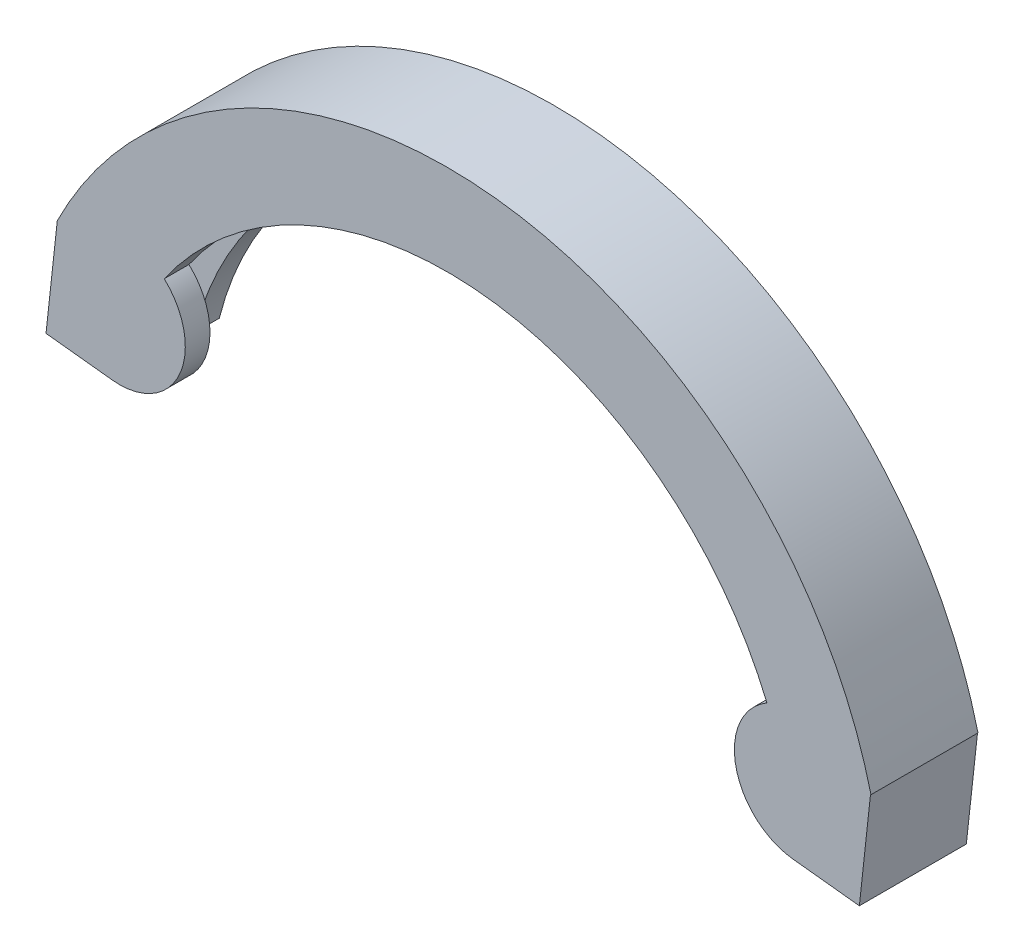
ISO-10303-21;
HEADER;
FILE_DESCRIPTION(('STEP AP214'),'2;1');
FILE_NAME('part.step','',(''),(''),'','','');
FILE_SCHEMA(('AUTOMOTIVE_DESIGN { 1 0 10303 214 1 1 1 1 }'));
ENDSEC;
DATA;
#1=APPLICATION_CONTEXT('core data for automotive mechanical design processes');
#2=APPLICATION_PROTOCOL_DEFINITION('international standard','automotive_design',2000,#1);
#3=PRODUCT_CONTEXT('',#1,'mechanical');
#4=PRODUCT('Part','Part','',(#3));
#5=PRODUCT_RELATED_PRODUCT_CATEGORY('part','',(#4));
#6=PRODUCT_DEFINITION_FORMATION('','',#4);
#7=PRODUCT_DEFINITION_CONTEXT('part definition',#1,'design');
#8=PRODUCT_DEFINITION('design','',#6,#7);
#9=PRODUCT_DEFINITION_SHAPE('','',#8);
#10=(LENGTH_UNIT() NAMED_UNIT(*) SI_UNIT(.MILLI.,.METRE.));
#11=(NAMED_UNIT(*) PLANE_ANGLE_UNIT() SI_UNIT($,.RADIAN.));
#12=(NAMED_UNIT(*) SI_UNIT($,.STERADIAN.) SOLID_ANGLE_UNIT());
#13=UNCERTAINTY_MEASURE_WITH_UNIT(LENGTH_MEASURE(1.E-05),#10,'distance_accuracy_value','');
#14=(GEOMETRIC_REPRESENTATION_CONTEXT(3) GLOBAL_UNCERTAINTY_ASSIGNED_CONTEXT((#13)) GLOBAL_UNIT_ASSIGNED_CONTEXT((#10,
#11,#12)) REPRESENTATION_CONTEXT('',''));
#15=CARTESIAN_POINT('',(0.,0.,0.));
#16=DIRECTION('',(0.,0.,1.));
#17=DIRECTION('',(1.,0.,0.));
#18=AXIS2_PLACEMENT_3D('',#15,#16,#17);
#19=CARTESIAN_POINT('',(0.,0.,-10.));
#20=DIRECTION('',(0.,0.,1.));
#21=DIRECTION('',(1.,0.,0.));
#22=AXIS2_PLACEMENT_3D('',#19,#20,#21);
#23=PLANE('',#22);
#24=CARTESIAN_POINT('',(0.,0.,-10.));
#25=DIRECTION('',(0.,0.,-1.));
#26=DIRECTION('',(-1.,0.,0.));
#27=AXIS2_PLACEMENT_3D('',#24,#25,#26);
#28=CIRCLE('',#27,42.);
#29=CARTESIAN_POINT('',(41.9826646344601,1.20659445981428,-10.));
#30=VERTEX_POINT('',#29);
#31=CARTESIAN_POINT('',(-40.7263530118166,10.2647050789048,-10.));
#32=VERTEX_POINT('',#31);
#33=EDGE_CURVE('E168',#30,#32,#28,.F.);
#34=ORIENTED_EDGE('',*,*,#33,.T.);
#35=DIRECTION('',(0.99405633822232,-0.108866874851961,0.));
#36=VECTOR('',#35,1.);
#37=CARTESIAN_POINT('',(53.,0.,-10.));
#38=LINE('',#37,#36);
#39=CARTESIAN_POINT('',(-48.7792443666767,11.146640117812,-10.));
#40=VERTEX_POINT('',#39);
#41=EDGE_CURVE('E187',#40,#32,#38,.T.);
#42=ORIENTED_EDGE('',*,*,#41,.F.);
#43=DIRECTION('',(0.108866874851961,0.99405633822232,0.));
#44=VECTOR('',#43,1.);
#45=CARTESIAN_POINT('',(-49.4074001779984,5.41099034845242,-10.));
#46=LINE('',#45,#44);
#47=CARTESIAN_POINT('',(-47.4196999914696,23.5605511913759,-10.));
#48=VERTEX_POINT('',#47);
#49=EDGE_CURVE('E208',#40,#48,#46,.T.);
#50=ORIENTED_EDGE('',*,*,#49,.T.);
#51=DIRECTION('',(-0.99405633822232,0.108866874851962,0.));
#52=VECTOR('',#51,1.);
#53=CARTESIAN_POINT('',(1.98770018652877,18.1495608429235,-10.));
#54=LINE('',#53,#52);
#55=CARTESIAN_POINT('',(-47.4723966917525,23.5663224186738,-10.));
#56=VERTEX_POINT('',#55);
#57=EDGE_CURVE('E194',#48,#56,#54,.T.);
#58=ORIENTED_EDGE('',*,*,#57,.T.);
#59=CARTESIAN_POINT('',(0.,0.,-10.));
#60=DIRECTION('',(0.,0.,1.));
#61=DIRECTION('',(1.,0.,0.));
#62=AXIS2_PLACEMENT_3D('',#59,#60,#61);
#63=CIRCLE('',#62,53.);
#64=CARTESIAN_POINT('',(51.450152385228,12.7232786472992,-10.));
#65=VERTEX_POINT('',#64);
#66=EDGE_CURVE('E190',#56,#65,#63,.F.);
#67=ORIENTED_EDGE('',*,*,#66,.T.);
#68=DIRECTION('',(-0.99405633822232,0.108866874851961,0.));
#69=VECTOR('',#68,1.);
#70=CARTESIAN_POINT('',(1.98669778213297,18.1404079537233,-10.));
#71=LINE('',#70,#69);
#72=CARTESIAN_POINT('',(51.3940979601314,12.729417605271,-10.));
#73=VERTEX_POINT('',#72);
#74=EDGE_CURVE('E193',#65,#73,#71,.T.);
#75=ORIENTED_EDGE('',*,*,#74,.T.);
#76=DIRECTION('',(0.108866874851961,0.99405633822232,0.));
#77=VECTOR('',#76,1.);
#78=CARTESIAN_POINT('',(49.4074001779984,-5.41099034845239,-10.));
#79=LINE('',#78,#77);
#80=CARTESIAN_POINT('',(50.0355559893201,0.324659420907144,-10.));
#81=VERTEX_POINT('',#80);
#82=EDGE_CURVE('E218',#81,#73,#79,.T.);
#83=ORIENTED_EDGE('',*,*,#82,.F.);
#84=EDGE_CURVE('E235',#30,#81,#38,.T.);
#85=ORIENTED_EDGE('',*,*,#84,.F.);
#86=EDGE_LOOP('',(#34,#42,#50,#58,#67,#75,#83,#85));
#87=FACE_BOUND('',#86,.T.);
#88=ADVANCED_FACE('F38',(#87),#23,.F.);
#89=CARTESIAN_POINT('',(0.,0.,3.));
#90=DIRECTION('',(0.,0.,-1.));
#91=DIRECTION('',(-1.,0.,0.));
#92=AXIS2_PLACEMENT_3D('',#89,#90,#91);
#93=PLANE('',#92);
#94=DIRECTION('',(-0.99405633822232,0.108866874851961,0.));
#95=VECTOR('',#94,1.);
#96=CARTESIAN_POINT('',(-51.7436883773565,11.4712995387191,3.));
#97=LINE('',#96,#95);
#98=CARTESIAN_POINT('',(-40.7263530118166,10.2647050789048,3.));
#99=VERTEX_POINT('',#98);
#100=CARTESIAN_POINT('',(-48.7792443666766,11.146640117812,3.));
#101=VERTEX_POINT('',#100);
#102=EDGE_CURVE('E135',#99,#101,#97,.T.);
#103=ORIENTED_EDGE('',*,*,#102,.F.);
#104=CARTESIAN_POINT('',(-39.8554180130009,18.2171557846834,3.));
#105=DIRECTION('',(0.,0.,1.));
#106=DIRECTION('',(1.,0.,0.));
#107=AXIS2_PLACEMENT_3D('',#104,#105,#106);
#108=CIRCLE('',#107,8.);
#109=CARTESIAN_POINT('',(-34.4118522596681,24.0795436846045,3.));
#110=VERTEX_POINT('',#109);
#111=EDGE_CURVE('E138',#99,#110,#108,.T.);
#112=ORIENTED_EDGE('',*,*,#111,.T.);
#113=CARTESIAN_POINT('',(0.,0.,3.));
#114=DIRECTION('',(0.,0.,-1.));
#115=DIRECTION('',(-1.,0.,0.));
#116=AXIS2_PLACEMENT_3D('',#113,#114,#115);
#117=CIRCLE('',#116,42.);
#118=CARTESIAN_POINT('',(38.8079210976164,16.0606743345721,3.));
#119=VERTEX_POINT('',#118);
#120=EDGE_CURVE('E56',#119,#110,#117,.F.);
#121=ORIENTED_EDGE('',*,*,#120,.F.);
#122=CARTESIAN_POINT('',(42.8535996332758,9.15904516559284,3.));
#123=DIRECTION('',(0.,0.,1.));
#124=DIRECTION('',(1.,0.,0.));
#125=AXIS2_PLACEMENT_3D('',#122,#123,#124);
#126=CIRCLE('',#125,8.);
#127=CARTESIAN_POINT('',(41.9826646344601,1.20659445981428,3.));
#128=VERTEX_POINT('',#127);
#129=EDGE_CURVE('E159',#119,#128,#126,.T.);
#130=ORIENTED_EDGE('',*,*,#129,.T.);
#131=CARTESIAN_POINT('',(50.0355559893201,0.324659420907147,3.));
#132=VERTEX_POINT('',#131);
#133=EDGE_CURVE('E147',#132,#128,#97,.T.);
#134=ORIENTED_EDGE('',*,*,#133,.F.);
#135=DIRECTION('',(-0.108866874851961,-0.99405633822232,0.));
#136=VECTOR('',#135,1.);
#137=CARTESIAN_POINT('',(49.4074001779984,-5.41099034845239,3.));
#138=LINE('',#137,#136);
#139=CARTESIAN_POINT('',(51.3940979601314,12.729417605271,3.));
#140=VERTEX_POINT('',#139);
#141=EDGE_CURVE('E182',#140,#132,#138,.T.);
#142=ORIENTED_EDGE('',*,*,#141,.F.);
#143=DIRECTION('',(0.99405633822232,-0.108866874851961,0.));
#144=VECTOR('',#143,1.);
#145=CARTESIAN_POINT('',(1.98669778213297,18.1404079537233,3.));
#146=LINE('',#145,#144);
#147=CARTESIAN_POINT('',(51.450152385228,12.7232786472992,3.));
#148=VERTEX_POINT('',#147);
#149=EDGE_CURVE('E211',#140,#148,#146,.T.);
#150=ORIENTED_EDGE('',*,*,#149,.T.);
#151=CARTESIAN_POINT('',(0.,0.,3.));
#152=DIRECTION('',(0.,0.,-1.));
#153=DIRECTION('',(-1.,0.,0.));
#154=AXIS2_PLACEMENT_3D('',#151,#152,#153);
#155=CIRCLE('',#154,53.);
#156=CARTESIAN_POINT('',(-47.4723966917525,23.5663224186738,3.));
#157=VERTEX_POINT('',#156);
#158=EDGE_CURVE('E178',#157,#148,#155,.T.);
#159=ORIENTED_EDGE('',*,*,#158,.F.);
#160=DIRECTION('',(0.99405633822232,-0.108866874851962,0.));
#161=VECTOR('',#160,1.);
#162=CARTESIAN_POINT('',(1.98770018652877,18.1495608429235,3.));
#163=LINE('',#162,#161);
#164=CARTESIAN_POINT('',(-47.4196999914696,23.5605511913759,3.));
#165=VERTEX_POINT('',#164);
#166=EDGE_CURVE('E209',#157,#165,#163,.T.);
#167=ORIENTED_EDGE('',*,*,#166,.T.);
#168=DIRECTION('',(-0.108866874851961,-0.99405633822232,0.));
#169=VECTOR('',#168,1.);
#170=CARTESIAN_POINT('',(-49.4074001779984,5.41099034845242,3.));
#171=LINE('',#170,#169);
#172=EDGE_CURVE('E140',#165,#101,#171,.T.);
#173=ORIENTED_EDGE('',*,*,#172,.T.);
#174=EDGE_LOOP('',(#103,#112,#121,#130,#134,#142,#150,#159,#167,#173));
#175=FACE_BOUND('',#174,.T.);
#176=ADVANCED_FACE('F40',(#175),#93,.F.);
#177=CARTESIAN_POINT('',(-51.7436883773565,11.4712995387191,154.383627261102));
#178=DIRECTION('',(0.108866874851961,0.99405633822232,0.));
#179=DIRECTION('',(-0.99405633822232,0.108866874851961,0.));
#180=AXIS2_PLACEMENT_3D('',#177,#178,#179);
#181=PLANE('',#180);
#182=DIRECTION('',(0.,0.,-1.));
#183=VECTOR('',#182,1.);
#184=CARTESIAN_POINT('',(41.9826646344601,1.20659445981428,10.));
#185=LINE('',#184,#183);
#186=CARTESIAN_POINT('',(41.9826646344601,1.20659445981428,-7.));
#187=VERTEX_POINT('',#186);
#188=EDGE_CURVE('E215',#187,#30,#185,.T.);
#189=ORIENTED_EDGE('',*,*,#188,.T.);
#190=ORIENTED_EDGE('',*,*,#84,.T.);
#191=DIRECTION('',(0.,0.,-1.));
#192=VECTOR('',#191,1.);
#193=CARTESIAN_POINT('',(50.0355559893201,0.324659420907147,154.383627261102));
#194=LINE('',#193,#192);
#195=EDGE_CURVE('E179',#132,#81,#194,.T.);
#196=ORIENTED_EDGE('',*,*,#195,.F.);
#197=ORIENTED_EDGE('',*,*,#133,.T.);
#198=CARTESIAN_POINT('',(41.9826646344601,1.20659445981428,0.));
#199=VERTEX_POINT('',#198);
#200=EDGE_CURVE('E231',#128,#199,#185,.T.);
#201=ORIENTED_EDGE('',*,*,#200,.T.);
#202=DIRECTION('',(0.99405633822232,-0.108866874851961,0.));
#203=VECTOR('',#202,1.);
#204=CARTESIAN_POINT('',(0.62815581132173,5.73564976935956,0.));
#205=LINE('',#204,#203);
#206=CARTESIAN_POINT('',(49.9989197371834,0.328671743069433,0.));
#207=VERTEX_POINT('',#206);
#208=EDGE_CURVE('E202',#199,#207,#205,.T.);
#209=ORIENTED_EDGE('',*,*,#208,.T.);
#210=DIRECTION('',(0.,0.,-1.));
#211=VECTOR('',#210,1.);
#212=CARTESIAN_POINT('',(49.9989197371834,0.328671743069432,0.));
#213=LINE('',#212,#211);
#214=CARTESIAN_POINT('',(49.9989197371834,0.328671743069432,-7.));
#215=VERTEX_POINT('',#214);
#216=EDGE_CURVE('E199',#207,#215,#213,.T.);
#217=ORIENTED_EDGE('',*,*,#216,.T.);
#218=DIRECTION('',(-0.99405633822232,0.108866874851961,0.));
#219=VECTOR('',#218,1.);
#220=CARTESIAN_POINT('',(0.628155811321729,5.73564976935956,-7.));
#221=LINE('',#220,#219);
#222=EDGE_CURVE('E145',#215,#187,#221,.T.);
#223=ORIENTED_EDGE('',*,*,#222,.T.);
#224=EDGE_LOOP('',(#189,#190,#196,#197,#201,#209,#217,#223));
#225=FACE_BOUND('',#224,.T.);
#226=ADVANCED_FACE('F266',(#225),#181,.F.);
#227=DIRECTION('',(0.,0.,-1.));
#228=VECTOR('',#227,1.);
#229=CARTESIAN_POINT('',(-40.7263530118166,10.2647050789048,10.));
#230=LINE('',#229,#228);
#231=CARTESIAN_POINT('',(-40.7263530118166,10.2647050789048,0.));
#232=VERTEX_POINT('',#231);
#233=EDGE_CURVE('E149',#99,#232,#230,.T.);
#234=ORIENTED_EDGE('',*,*,#233,.F.);
#235=ORIENTED_EDGE('',*,*,#102,.T.);
#236=DIRECTION('',(0.,0.,-1.));
#237=VECTOR('',#236,1.);
#238=CARTESIAN_POINT('',(-48.7792443666766,11.146640117812,154.383627261102));
#239=LINE('',#238,#237);
#240=EDGE_CURVE('E144',#101,#40,#239,.T.);
#241=ORIENTED_EDGE('',*,*,#240,.T.);
#242=ORIENTED_EDGE('',*,*,#41,.T.);
#243=CARTESIAN_POINT('',(-40.7263530118166,10.2647050789048,-7.));
#244=VERTEX_POINT('',#243);
#245=EDGE_CURVE('E156',#244,#32,#230,.T.);
#246=ORIENTED_EDGE('',*,*,#245,.F.);
#247=CARTESIAN_POINT('',(-48.7426081145399,11.1426277956497,-7.));
#248=VERTEX_POINT('',#247);
#249=EDGE_CURVE('E205',#244,#248,#221,.T.);
#250=ORIENTED_EDGE('',*,*,#249,.T.);
#251=DIRECTION('',(0.,0.,-1.));
#252=VECTOR('',#251,1.);
#253=CARTESIAN_POINT('',(-48.7426081145399,11.1426277956497,0.));
#254=LINE('',#253,#252);
#255=CARTESIAN_POINT('',(-48.7426081145399,11.1426277956497,0.));
#256=VERTEX_POINT('',#255);
#257=EDGE_CURVE('E203',#248,#256,#254,.F.);
#258=ORIENTED_EDGE('',*,*,#257,.T.);
#259=EDGE_CURVE('E152',#256,#232,#205,.T.);
#260=ORIENTED_EDGE('',*,*,#259,.T.);
#261=EDGE_LOOP('',(#234,#235,#241,#242,#246,#250,#258,#260));
#262=FACE_BOUND('',#261,.T.);
#263=ADVANCED_FACE('F150',(#262),#181,.F.);
#264=CARTESIAN_POINT('',(0.,0.,-7.));
#265=DIRECTION('',(0.,0.,1.));
#266=DIRECTION('',(1.,0.,0.));
#267=AXIS2_PLACEMENT_3D('',#264,#265,#266);
#268=PLANE('',#267);
#269=ORIENTED_EDGE('',*,*,#249,.F.);
#270=CARTESIAN_POINT('',(0.,0.,-7.));
#271=DIRECTION('',(0.,0.,1.));
#272=DIRECTION('',(1.,0.,0.));
#273=AXIS2_PLACEMENT_3D('',#270,#271,#272);
#274=CIRCLE('',#273,42.);
#275=EDGE_CURVE('E173',#244,#187,#274,.F.);
#276=ORIENTED_EDGE('',*,*,#275,.T.);
#277=ORIENTED_EDGE('',*,*,#222,.F.);
#278=CARTESIAN_POINT('',(0.,0.,-7.));
#279=DIRECTION('',(0.,0.,-1.));
#280=DIRECTION('',(-1.,0.,0.));
#281=AXIS2_PLACEMENT_3D('',#278,#279,#280);
#282=CIRCLE('',#281,50.);
#283=EDGE_CURVE('E185',#248,#215,#282,.T.);
#284=ORIENTED_EDGE('',*,*,#283,.F.);
#285=EDGE_LOOP('',(#269,#276,#277,#284));
#286=FACE_BOUND('',#285,.T.);
#287=ADVANCED_FACE('F256',(#286),#268,.T.);
#288=CARTESIAN_POINT('',(0.,0.,0.));
#289=DIRECTION('',(0.,0.,-1.));
#290=DIRECTION('',(-1.,0.,0.));
#291=AXIS2_PLACEMENT_3D('',#288,#289,#290);
#292=PLANE('',#291);
#293=CARTESIAN_POINT('',(0.,0.,0.));
#294=DIRECTION('',(0.,0.,-1.));
#295=DIRECTION('',(-1.,0.,0.));
#296=AXIS2_PLACEMENT_3D('',#293,#294,#295);
#297=CIRCLE('',#296,50.);
#298=EDGE_CURVE('E172',#256,#207,#297,.T.);
#299=ORIENTED_EDGE('',*,*,#298,.T.);
#300=ORIENTED_EDGE('',*,*,#208,.F.);
#301=CARTESIAN_POINT('',(42.8535996332758,9.15904516559284,0.));
#302=DIRECTION('',(0.,0.,1.));
#303=DIRECTION('',(1.,0.,0.));
#304=AXIS2_PLACEMENT_3D('',#301,#302,#303);
#305=CIRCLE('',#304,8.);
#306=CARTESIAN_POINT('',(38.8079210976164,16.0606743345721,0.));
#307=VERTEX_POINT('',#306);
#308=EDGE_CURVE('E163',#307,#199,#305,.T.);
#309=ORIENTED_EDGE('',*,*,#308,.F.);
#310=CARTESIAN_POINT('',(0.,0.,0.));
#311=DIRECTION('',(0.,0.,-1.));
#312=DIRECTION('',(-1.,0.,0.));
#313=AXIS2_PLACEMENT_3D('',#310,#311,#312);
#314=CIRCLE('',#313,42.);
#315=CARTESIAN_POINT('',(-34.4118522596681,24.0795436846045,0.));
#316=VERTEX_POINT('',#315);
#317=EDGE_CURVE('E170',#307,#316,#314,.F.);
#318=ORIENTED_EDGE('',*,*,#317,.T.);
#319=CARTESIAN_POINT('',(-39.8554180130009,18.2171557846834,0.));
#320=DIRECTION('',(0.,0.,1.));
#321=DIRECTION('',(1.,0.,0.));
#322=AXIS2_PLACEMENT_3D('',#319,#320,#321);
#323=CIRCLE('',#322,8.);
#324=EDGE_CURVE('E160',#232,#316,#323,.T.);
#325=ORIENTED_EDGE('',*,*,#324,.F.);
#326=ORIENTED_EDGE('',*,*,#259,.F.);
#327=EDGE_LOOP('',(#299,#300,#309,#318,#325,#326));
#328=FACE_BOUND('',#327,.T.);
#329=ADVANCED_FACE('F264',(#328),#292,.T.);
#330=CARTESIAN_POINT('',(0.,0.,0.));
#331=DIRECTION('',(0.,0.,-1.));
#332=DIRECTION('',(-1.,0.,0.));
#333=AXIS2_PLACEMENT_3D('',#330,#331,#332);
#334=CYLINDRICAL_SURFACE('',#333,53.);
#335=ORIENTED_EDGE('',*,*,#158,.T.);
#336=DIRECTION('',(0.,0.,-1.));
#337=VECTOR('',#336,1.);
#338=CARTESIAN_POINT('',(51.450152385228,12.7232786472992,0.));
#339=LINE('',#338,#337);
#340=EDGE_CURVE('E174',#148,#65,#339,.T.);
#341=ORIENTED_EDGE('',*,*,#340,.T.);
#342=ORIENTED_EDGE('',*,*,#66,.F.);
#343=DIRECTION('',(0.,0.,-1.));
#344=VECTOR('',#343,1.);
#345=CARTESIAN_POINT('',(-47.4723966917525,23.5663224186738,0.));
#346=LINE('',#345,#344);
#347=EDGE_CURVE('E177',#56,#157,#346,.F.);
#348=ORIENTED_EDGE('',*,*,#347,.T.);
#349=EDGE_LOOP('',(#335,#341,#342,#348));
#350=FACE_BOUND('',#349,.T.);
#351=ADVANCED_FACE('F295',(#350),#334,.T.);
#352=CARTESIAN_POINT('',(0.,0.,0.));
#353=DIRECTION('',(0.,0.,-1.));
#354=DIRECTION('',(-1.,0.,0.));
#355=AXIS2_PLACEMENT_3D('',#352,#353,#354);
#356=CYLINDRICAL_SURFACE('',#355,50.);
#357=ORIENTED_EDGE('',*,*,#216,.F.);
#358=ORIENTED_EDGE('',*,*,#298,.F.);
#359=ORIENTED_EDGE('',*,*,#257,.F.);
#360=ORIENTED_EDGE('',*,*,#283,.T.);
#361=EDGE_LOOP('',(#357,#358,#359,#360));
#362=FACE_BOUND('',#361,.T.);
#363=ADVANCED_FACE('F260',(#362),#356,.F.);
#364=CARTESIAN_POINT('',(-47.4196999914696,23.5605511913759,-10.000012));
#365=DIRECTION('',(0.108866874851961,0.99405633822232,0.));
#366=DIRECTION('',(-0.99405633822232,0.108866874851962,0.));
#367=AXIS2_PLACEMENT_3D('',#364,#365,#366);
#368=PLANE('',#367);
#369=DIRECTION('',(0.,0.,1.));
#370=VECTOR('',#369,1.);
#371=CARTESIAN_POINT('',(-47.4196999914696,23.5605511913759,-10.000012));
#372=LINE('',#371,#370);
#373=EDGE_CURVE('E197',#48,#165,#372,.T.);
#374=ORIENTED_EDGE('',*,*,#373,.T.);
#375=ORIENTED_EDGE('',*,*,#166,.F.);
#376=ORIENTED_EDGE('',*,*,#347,.F.);
#377=ORIENTED_EDGE('',*,*,#57,.F.);
#378=EDGE_LOOP('',(#374,#375,#376,#377));
#379=FACE_BOUND('',#378,.T.);
#380=ADVANCED_FACE('F340',(#379),#368,.F.);
#381=CARTESIAN_POINT('',(-48.7792443666766,11.146640117812,-10.000012));
#382=DIRECTION('',(0.99405633822232,-0.108866874851961,0.));
#383=DIRECTION('',(0.108866874851961,0.99405633822232,0.));
#384=AXIS2_PLACEMENT_3D('',#381,#382,#383);
#385=PLANE('',#384);
#386=ORIENTED_EDGE('',*,*,#240,.F.);
#387=ORIENTED_EDGE('',*,*,#172,.F.);
#388=ORIENTED_EDGE('',*,*,#373,.F.);
#389=ORIENTED_EDGE('',*,*,#49,.F.);
#390=EDGE_LOOP('',(#386,#387,#388,#389));
#391=FACE_BOUND('',#390,.T.);
#392=ADVANCED_FACE('F331',(#391),#385,.F.);
#393=CARTESIAN_POINT('',(81.215788106801,9.46341135971213,-10.000012));
#394=DIRECTION('',(0.108866874851961,0.99405633822232,0.));
#395=DIRECTION('',(-0.99405633822232,0.108866874851961,0.));
#396=AXIS2_PLACEMENT_3D('',#393,#394,#395);
#397=PLANE('',#396);
#398=ORIENTED_EDGE('',*,*,#340,.F.);
#399=ORIENTED_EDGE('',*,*,#149,.F.);
#400=DIRECTION('',(0.,0.,1.));
#401=VECTOR('',#400,1.);
#402=CARTESIAN_POINT('',(51.3940979601314,12.729417605271,-10.000012));
#403=LINE('',#402,#401);
#404=EDGE_CURVE('E224',#73,#140,#403,.T.);
#405=ORIENTED_EDGE('',*,*,#404,.F.);
#406=ORIENTED_EDGE('',*,*,#74,.F.);
#407=EDGE_LOOP('',(#398,#399,#405,#406));
#408=FACE_BOUND('',#407,.T.);
#409=ADVANCED_FACE('F282',(#408),#397,.F.);
#410=CARTESIAN_POINT('',(50.0355559893201,0.324659420907144,-10.000012));
#411=DIRECTION('',(0.99405633822232,-0.108866874851961,0.));
#412=DIRECTION('',(0.108866874851961,0.99405633822232,0.));
#413=AXIS2_PLACEMENT_3D('',#410,#411,#412);
#414=PLANE('',#413);
#415=ORIENTED_EDGE('',*,*,#82,.T.);
#416=ORIENTED_EDGE('',*,*,#404,.T.);
#417=ORIENTED_EDGE('',*,*,#141,.T.);
#418=ORIENTED_EDGE('',*,*,#195,.T.);
#419=EDGE_LOOP('',(#415,#416,#417,#418));
#420=FACE_BOUND('',#419,.T.);
#421=ADVANCED_FACE('F274',(#420),#414,.T.);
#422=CARTESIAN_POINT('',(0.,0.,10.));
#423=DIRECTION('',(0.,0.,-1.));
#424=DIRECTION('',(-1.,0.,0.));
#425=AXIS2_PLACEMENT_3D('',#422,#423,#424);
#426=CYLINDRICAL_SURFACE('',#425,42.);
#427=DIRECTION('',(0.,0.,1.));
#428=VECTOR('',#427,1.);
#429=CARTESIAN_POINT('',(-34.4118522596681,24.0795436846045,1.5));
#430=LINE('',#429,#428);
#431=EDGE_CURVE('E11',#316,#110,#430,.T.);
#432=ORIENTED_EDGE('',*,*,#431,.F.);
#433=ORIENTED_EDGE('',*,*,#317,.F.);
#434=DIRECTION('',(0.,0.,1.));
#435=VECTOR('',#434,1.);
#436=CARTESIAN_POINT('',(38.8079210976164,16.0606743345721,1.5));
#437=LINE('',#436,#435);
#438=EDGE_CURVE('E46',#119,#307,#437,.F.);
#439=ORIENTED_EDGE('',*,*,#438,.F.);
#440=ORIENTED_EDGE('',*,*,#120,.T.);
#441=EDGE_LOOP('',(#432,#433,#439,#440));
#442=FACE_BOUND('',#441,.T.);
#443=ADVANCED_FACE('F272',(#442),#426,.F.);
#444=ORIENTED_EDGE('',*,*,#33,.F.);
#445=ORIENTED_EDGE('',*,*,#188,.F.);
#446=ORIENTED_EDGE('',*,*,#275,.F.);
#447=ORIENTED_EDGE('',*,*,#245,.T.);
#448=EDGE_LOOP('',(#444,#445,#446,#447));
#449=FACE_BOUND('',#448,.T.);
#450=ADVANCED_FACE('F245',(#449),#426,.F.);
#451=CARTESIAN_POINT('',(42.8535996332758,9.15904516559284,0.));
#452=DIRECTION('',(0.,0.,1.));
#453=DIRECTION('',(1.,0.,0.));
#454=AXIS2_PLACEMENT_3D('',#451,#452,#453);
#455=CYLINDRICAL_SURFACE('',#454,8.);
#456=ORIENTED_EDGE('',*,*,#308,.T.);
#457=ORIENTED_EDGE('',*,*,#200,.F.);
#458=ORIENTED_EDGE('',*,*,#129,.F.);
#459=ORIENTED_EDGE('',*,*,#438,.T.);
#460=EDGE_LOOP('',(#456,#457,#458,#459));
#461=FACE_BOUND('',#460,.T.);
#462=ADVANCED_FACE('F270',(#461),#455,.T.);
#463=CARTESIAN_POINT('',(-39.8554180130009,18.2171557846834,0.));
#464=DIRECTION('',(0.,0.,1.));
#465=DIRECTION('',(1.,0.,0.));
#466=AXIS2_PLACEMENT_3D('',#463,#464,#465);
#467=CYLINDRICAL_SURFACE('',#466,8.);
#468=ORIENTED_EDGE('',*,*,#324,.T.);
#469=ORIENTED_EDGE('',*,*,#431,.T.);
#470=ORIENTED_EDGE('',*,*,#111,.F.);
#471=ORIENTED_EDGE('',*,*,#233,.T.);
#472=EDGE_LOOP('',(#468,#469,#470,#471));
#473=FACE_BOUND('',#472,.T.);
#474=ADVANCED_FACE('F158',(#473),#467,.T.);
#475=CLOSED_SHELL('',(#88,#176,#226,#263,#287,#329,#351,#363,#380,#392,#409,#421,#443,#450,#462,#474));
#476=MANIFOLD_SOLID_BREP('B2',#475);
#477=ADVANCED_BREP_SHAPE_REPRESENTATION('',(#18,#476),#14);
#478=SHAPE_DEFINITION_REPRESENTATION(#9,#477);
ENDSEC;
END-ISO-10303-21;
